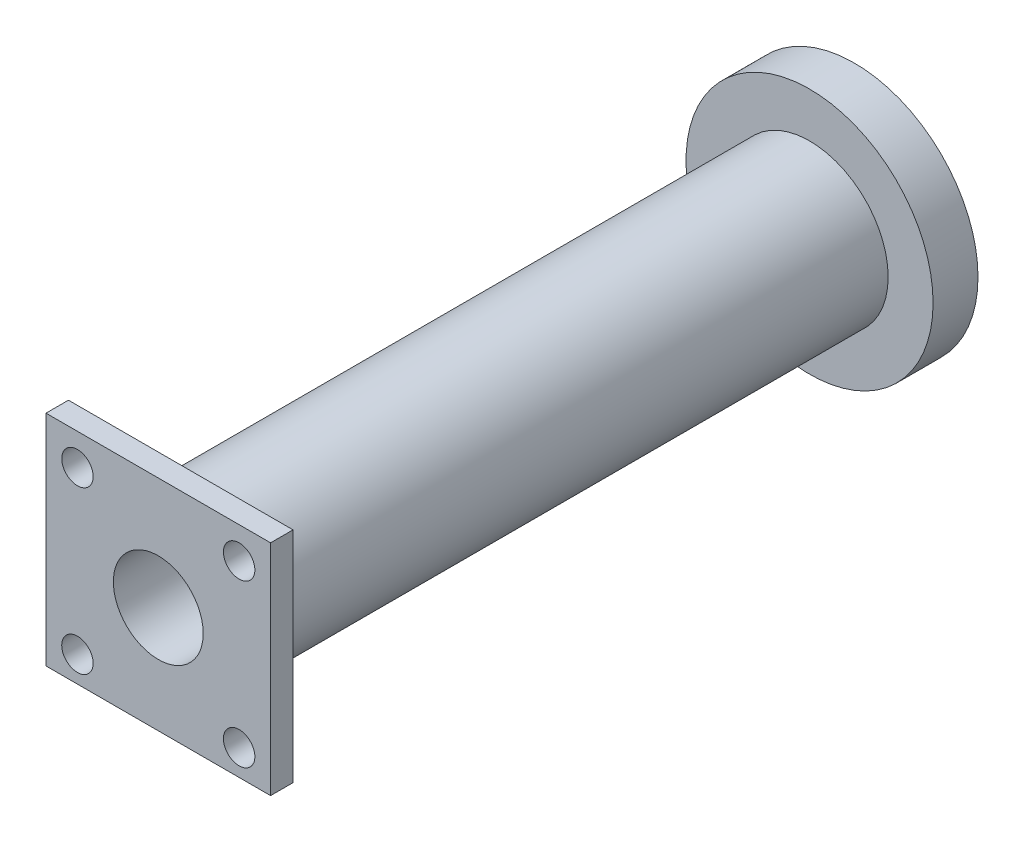
ISO-10303-21;
HEADER;
FILE_DESCRIPTION(('STEP AP214'),'2;1');
FILE_NAME('part.step','',(''),(''),'','','');
FILE_SCHEMA(('AUTOMOTIVE_DESIGN { 1 0 10303 214 1 1 1 1 }'));
ENDSEC;
DATA;
#1=APPLICATION_CONTEXT('core data for automotive mechanical design processes');
#2=APPLICATION_PROTOCOL_DEFINITION('international standard','automotive_design',2000,#1);
#3=PRODUCT_CONTEXT('',#1,'mechanical');
#4=PRODUCT('Part','Part','',(#3));
#5=PRODUCT_RELATED_PRODUCT_CATEGORY('part','',(#4));
#6=PRODUCT_DEFINITION_FORMATION('','',#4);
#7=PRODUCT_DEFINITION_CONTEXT('part definition',#1,'design');
#8=PRODUCT_DEFINITION('design','',#6,#7);
#9=PRODUCT_DEFINITION_SHAPE('','',#8);
#10=(LENGTH_UNIT() NAMED_UNIT(*) SI_UNIT(.MILLI.,.METRE.));
#11=(NAMED_UNIT(*) PLANE_ANGLE_UNIT() SI_UNIT($,.RADIAN.));
#12=(NAMED_UNIT(*) SI_UNIT($,.STERADIAN.) SOLID_ANGLE_UNIT());
#13=UNCERTAINTY_MEASURE_WITH_UNIT(LENGTH_MEASURE(1.E-05),#10,'distance_accuracy_value','');
#14=(GEOMETRIC_REPRESENTATION_CONTEXT(3) GLOBAL_UNCERTAINTY_ASSIGNED_CONTEXT((#13)) GLOBAL_UNIT_ASSIGNED_CONTEXT((#10,
#11,#12)) REPRESENTATION_CONTEXT('',''));
#15=CARTESIAN_POINT('',(0.,0.,0.));
#16=DIRECTION('',(0.,0.,1.));
#17=DIRECTION('',(1.,0.,0.));
#18=AXIS2_PLACEMENT_3D('',#15,#16,#17);
#19=CARTESIAN_POINT('',(0.,0.,50.8));
#20=DIRECTION('',(0.,0.,-1.));
#21=DIRECTION('',(-1.,0.,0.));
#22=AXIS2_PLACEMENT_3D('',#19,#20,#21);
#23=CYLINDRICAL_SURFACE('',#22,139.7);
#24=CARTESIAN_POINT('',(0.,0.,50.8));
#25=DIRECTION('',(0.,0.,1.));
#26=DIRECTION('',(1.,0.,0.));
#27=AXIS2_PLACEMENT_3D('',#24,#25,#26);
#28=CIRCLE('',#27,139.7);
#29=CARTESIAN_POINT('',(139.7,0.,50.8));
#30=VERTEX_POINT('',#29);
#31=EDGE_CURVE('E11',#30,#30,#28,.T.);
#32=ORIENTED_EDGE('',*,*,#31,.F.);
#33=EDGE_LOOP('',(#32));
#34=FACE_BOUND('',#33,.T.);
#35=CARTESIAN_POINT('',(0.,0.,0.));
#36=DIRECTION('',(0.,0.,1.));
#37=DIRECTION('',(1.,0.,0.));
#38=AXIS2_PLACEMENT_3D('',#35,#36,#37);
#39=CIRCLE('',#38,139.7);
#40=CARTESIAN_POINT('',(139.7,0.,0.));
#41=VERTEX_POINT('',#40);
#42=EDGE_CURVE('E42',#41,#41,#39,.T.);
#43=ORIENTED_EDGE('',*,*,#42,.T.);
#44=EDGE_LOOP('',(#43));
#45=FACE_BOUND('',#44,.T.);
#46=ADVANCED_FACE('F39',(#34,#45),#23,.T.);
#47=CARTESIAN_POINT('',(0.,0.,50.8));
#48=DIRECTION('',(0.,0.,1.));
#49=DIRECTION('',(1.,0.,0.));
#50=AXIS2_PLACEMENT_3D('',#47,#48,#49);
#51=PLANE('',#50);
#52=CARTESIAN_POINT('',(0.,0.,50.8));
#53=DIRECTION('',(0.,0.,1.));
#54=DIRECTION('',(1.,0.,0.));
#55=AXIS2_PLACEMENT_3D('',#52,#53,#54);
#56=CIRCLE('',#55,88.9);
#57=CARTESIAN_POINT('',(88.9,0.,50.8));
#58=VERTEX_POINT('',#57);
#59=EDGE_CURVE('E48',#58,#58,#56,.T.);
#60=ORIENTED_EDGE('',*,*,#59,.F.);
#61=EDGE_LOOP('',(#60));
#62=FACE_BOUND('',#61,.T.);
#63=ORIENTED_EDGE('',*,*,#31,.T.);
#64=EDGE_LOOP('',(#63));
#65=FACE_BOUND('',#64,.T.);
#66=ADVANCED_FACE('F135',(#62,#65),#51,.T.);
#67=CARTESIAN_POINT('',(0.,0.,0.));
#68=DIRECTION('',(0.,0.,1.));
#69=DIRECTION('',(1.,0.,0.));
#70=AXIS2_PLACEMENT_3D('',#67,#68,#69);
#71=PLANE('',#70);
#72=ORIENTED_EDGE('',*,*,#42,.F.);
#73=EDGE_LOOP('',(#72));
#74=FACE_BOUND('',#73,.T.);
#75=CARTESIAN_POINT('',(0.,0.,0.));
#76=DIRECTION('',(0.,0.,1.));
#77=DIRECTION('',(1.,0.,0.));
#78=AXIS2_PLACEMENT_3D('',#75,#76,#77);
#79=CIRCLE('',#78,50.8);
#80=CARTESIAN_POINT('',(50.8,0.,0.));
#81=VERTEX_POINT('',#80);
#82=EDGE_CURVE('E118',#81,#81,#79,.T.);
#83=ORIENTED_EDGE('',*,*,#82,.T.);
#84=EDGE_LOOP('',(#83));
#85=FACE_BOUND('',#84,.T.);
#86=ADVANCED_FACE('F131',(#74,#85),#71,.F.);
#87=CARTESIAN_POINT('',(0.,0.,762.));
#88=DIRECTION('',(0.,0.,-1.));
#89=DIRECTION('',(-1.,0.,0.));
#90=AXIS2_PLACEMENT_3D('',#87,#88,#89);
#91=CYLINDRICAL_SURFACE('',#90,50.8);
#92=ORIENTED_EDGE('',*,*,#82,.F.);
#93=EDGE_LOOP('',(#92));
#94=FACE_BOUND('',#93,.T.);
#95=CARTESIAN_POINT('',(0.,0.,787.4));
#96=DIRECTION('',(0.,0.,1.));
#97=DIRECTION('',(1.,0.,0.));
#98=AXIS2_PLACEMENT_3D('',#95,#96,#97);
#99=CIRCLE('',#98,50.8);
#100=CARTESIAN_POINT('',(50.8,0.,787.4));
#101=VERTEX_POINT('',#100);
#102=EDGE_CURVE('E144',#101,#101,#99,.T.);
#103=ORIENTED_EDGE('',*,*,#102,.T.);
#104=EDGE_LOOP('',(#103));
#105=FACE_BOUND('',#104,.T.);
#106=ADVANCED_FACE('F134',(#94,#105),#91,.F.);
#107=CARTESIAN_POINT('',(0.,0.,762.));
#108=DIRECTION('',(0.,0.,-1.));
#109=DIRECTION('',(-1.,0.,0.));
#110=AXIS2_PLACEMENT_3D('',#107,#108,#109);
#111=CYLINDRICAL_SURFACE('',#110,88.9);
#112=ORIENTED_EDGE('',*,*,#59,.T.);
#113=EDGE_LOOP('',(#112));
#114=FACE_BOUND('',#113,.T.);
#115=CARTESIAN_POINT('',(0.,0.,762.));
#116=DIRECTION('',(0.,0.,1.));
#117=DIRECTION('',(1.,0.,0.));
#118=AXIS2_PLACEMENT_3D('',#115,#116,#117);
#119=CIRCLE('',#118,88.9);
#120=CARTESIAN_POINT('',(88.9,0.,762.));
#121=VERTEX_POINT('',#120);
#122=EDGE_CURVE('E119',#121,#121,#119,.T.);
#123=ORIENTED_EDGE('',*,*,#122,.F.);
#124=EDGE_LOOP('',(#123));
#125=FACE_BOUND('',#124,.T.);
#126=ADVANCED_FACE('F140',(#114,#125),#111,.T.);
#127=CARTESIAN_POINT('',(0.,0.,787.4));
#128=DIRECTION('',(0.,0.,1.));
#129=DIRECTION('',(1.,0.,0.));
#130=AXIS2_PLACEMENT_3D('',#127,#128,#129);
#131=PLANE('',#130);
#132=CARTESIAN_POINT('',(-91.44,-91.44,787.4));
#133=DIRECTION('',(0.,0.,1.));
#134=DIRECTION('',(-1.,0.,0.));
#135=AXIS2_PLACEMENT_3D('',#132,#133,#134);
#136=CIRCLE('',#135,17.78);
#137=CARTESIAN_POINT('',(-109.22,-91.44,787.4));
#138=VERTEX_POINT('',#137);
#139=EDGE_CURVE('E149',#138,#138,#136,.T.);
#140=ORIENTED_EDGE('',*,*,#139,.F.);
#141=EDGE_LOOP('',(#140));
#142=FACE_BOUND('',#141,.T.);
#143=CARTESIAN_POINT('',(91.44,91.44,787.4));
#144=DIRECTION('',(0.,0.,1.));
#145=DIRECTION('',(-1.,0.,0.));
#146=AXIS2_PLACEMENT_3D('',#143,#144,#145);
#147=CIRCLE('',#146,17.78);
#148=CARTESIAN_POINT('',(73.6600000000001,91.44,787.4));
#149=VERTEX_POINT('',#148);
#150=EDGE_CURVE('E161',#149,#149,#147,.T.);
#151=ORIENTED_EDGE('',*,*,#150,.F.);
#152=EDGE_LOOP('',(#151));
#153=FACE_BOUND('',#152,.T.);
#154=DIRECTION('',(0.,-1.,0.));
#155=VECTOR('',#154,1.);
#156=CARTESIAN_POINT('',(-127.,127.,787.4));
#157=LINE('',#156,#155);
#158=CARTESIAN_POINT('',(-127.,127.,787.4));
#159=VERTEX_POINT('',#158);
#160=CARTESIAN_POINT('',(-127.,-120.65,787.4));
#161=VERTEX_POINT('',#160);
#162=EDGE_CURVE('E93',#159,#161,#157,.T.);
#163=ORIENTED_EDGE('',*,*,#162,.T.);
#164=DIRECTION('',(1.,0.,0.));
#165=VECTOR('',#164,1.);
#166=CARTESIAN_POINT('',(-127.,-120.65,787.4));
#167=LINE('',#166,#165);
#168=CARTESIAN_POINT('',(127.,-120.65,787.4));
#169=VERTEX_POINT('',#168);
#170=EDGE_CURVE('E87',#161,#169,#167,.T.);
#171=ORIENTED_EDGE('',*,*,#170,.T.);
#172=DIRECTION('',(0.,1.,0.));
#173=VECTOR('',#172,1.);
#174=CARTESIAN_POINT('',(127.,127.,787.4));
#175=LINE('',#174,#173);
#176=CARTESIAN_POINT('',(127.,127.,787.4));
#177=VERTEX_POINT('',#176);
#178=EDGE_CURVE('E91',#169,#177,#175,.T.);
#179=ORIENTED_EDGE('',*,*,#178,.T.);
#180=DIRECTION('',(-1.,0.,0.));
#181=VECTOR('',#180,1.);
#182=CARTESIAN_POINT('',(-127.,127.,787.4));
#183=LINE('',#182,#181);
#184=EDGE_CURVE('E56',#177,#159,#183,.T.);
#185=ORIENTED_EDGE('',*,*,#184,.T.);
#186=EDGE_LOOP('',(#163,#171,#179,#185));
#187=FACE_BOUND('',#186,.T.);
#188=CARTESIAN_POINT('',(-91.44,91.44,787.4));
#189=DIRECTION('',(0.,0.,1.));
#190=DIRECTION('',(1.,0.,0.));
#191=AXIS2_PLACEMENT_3D('',#188,#189,#190);
#192=CIRCLE('',#191,17.78);
#193=CARTESIAN_POINT('',(-73.6600000000001,91.44,787.4));
#194=VERTEX_POINT('',#193);
#195=EDGE_CURVE('E111',#194,#194,#192,.T.);
#196=ORIENTED_EDGE('',*,*,#195,.F.);
#197=EDGE_LOOP('',(#196));
#198=FACE_BOUND('',#197,.T.);
#199=CARTESIAN_POINT('',(91.44,-91.44,787.4));
#200=DIRECTION('',(0.,0.,1.));
#201=DIRECTION('',(1.,0.,0.));
#202=AXIS2_PLACEMENT_3D('',#199,#200,#201);
#203=CIRCLE('',#202,17.78);
#204=CARTESIAN_POINT('',(109.22,-91.44,787.4));
#205=VERTEX_POINT('',#204);
#206=EDGE_CURVE('E155',#205,#205,#203,.T.);
#207=ORIENTED_EDGE('',*,*,#206,.F.);
#208=EDGE_LOOP('',(#207));
#209=FACE_BOUND('',#208,.T.);
#210=ORIENTED_EDGE('',*,*,#102,.F.);
#211=EDGE_LOOP('',(#210));
#212=FACE_BOUND('',#211,.T.);
#213=ADVANCED_FACE('F88',(#142,#153,#187,#198,#209,#212),#131,.T.);
#214=CARTESIAN_POINT('',(0.,0.,762.));
#215=DIRECTION('',(0.,0.,1.));
#216=DIRECTION('',(1.,0.,0.));
#217=AXIS2_PLACEMENT_3D('',#214,#215,#216);
#218=PLANE('',#217);
#219=ORIENTED_EDGE('',*,*,#122,.T.);
#220=EDGE_LOOP('',(#219));
#221=FACE_BOUND('',#220,.T.);
#222=DIRECTION('',(0.,-1.,0.));
#223=VECTOR('',#222,1.);
#224=CARTESIAN_POINT('',(-127.,127.,762.));
#225=LINE('',#224,#223);
#226=CARTESIAN_POINT('',(-127.,127.,762.));
#227=VERTEX_POINT('',#226);
#228=CARTESIAN_POINT('',(-127.,-120.65,762.));
#229=VERTEX_POINT('',#228);
#230=EDGE_CURVE('E108',#227,#229,#225,.T.);
#231=ORIENTED_EDGE('',*,*,#230,.F.);
#232=DIRECTION('',(-1.,0.,0.));
#233=VECTOR('',#232,1.);
#234=CARTESIAN_POINT('',(-127.,127.,762.));
#235=LINE('',#234,#233);
#236=CARTESIAN_POINT('',(127.,127.,762.));
#237=VERTEX_POINT('',#236);
#238=EDGE_CURVE('E79',#237,#227,#235,.T.);
#239=ORIENTED_EDGE('',*,*,#238,.F.);
#240=DIRECTION('',(0.,1.,0.));
#241=VECTOR('',#240,1.);
#242=CARTESIAN_POINT('',(127.,127.,762.));
#243=LINE('',#242,#241);
#244=CARTESIAN_POINT('',(127.,-120.65,762.));
#245=VERTEX_POINT('',#244);
#246=EDGE_CURVE('E73',#245,#237,#243,.T.);
#247=ORIENTED_EDGE('',*,*,#246,.F.);
#248=DIRECTION('',(1.,0.,0.));
#249=VECTOR('',#248,1.);
#250=CARTESIAN_POINT('',(-127.,-120.65,762.));
#251=LINE('',#250,#249);
#252=EDGE_CURVE('E98',#229,#245,#251,.T.);
#253=ORIENTED_EDGE('',*,*,#252,.F.);
#254=EDGE_LOOP('',(#231,#239,#247,#253));
#255=FACE_BOUND('',#254,.T.);
#256=CARTESIAN_POINT('',(-91.44,91.44,762.));
#257=DIRECTION('',(0.,0.,1.));
#258=DIRECTION('',(1.,0.,0.));
#259=AXIS2_PLACEMENT_3D('',#256,#257,#258);
#260=CIRCLE('',#259,17.78);
#261=CARTESIAN_POINT('',(-73.6600000000001,91.44,762.));
#262=VERTEX_POINT('',#261);
#263=EDGE_CURVE('E164',#262,#262,#260,.T.);
#264=ORIENTED_EDGE('',*,*,#263,.T.);
#265=EDGE_LOOP('',(#264));
#266=FACE_BOUND('',#265,.T.);
#267=CARTESIAN_POINT('',(91.44,91.44,762.));
#268=DIRECTION('',(0.,0.,1.));
#269=DIRECTION('',(-1.,0.,0.));
#270=AXIS2_PLACEMENT_3D('',#267,#268,#269);
#271=CIRCLE('',#270,17.78);
#272=CARTESIAN_POINT('',(73.6600000000001,91.44,762.));
#273=VERTEX_POINT('',#272);
#274=EDGE_CURVE('E158',#273,#273,#271,.T.);
#275=ORIENTED_EDGE('',*,*,#274,.T.);
#276=EDGE_LOOP('',(#275));
#277=FACE_BOUND('',#276,.T.);
#278=CARTESIAN_POINT('',(91.44,-91.44,762.));
#279=DIRECTION('',(0.,0.,1.));
#280=DIRECTION('',(1.,0.,0.));
#281=AXIS2_PLACEMENT_3D('',#278,#279,#280);
#282=CIRCLE('',#281,17.78);
#283=CARTESIAN_POINT('',(109.22,-91.44,762.));
#284=VERTEX_POINT('',#283);
#285=EDGE_CURVE('E153',#284,#284,#282,.T.);
#286=ORIENTED_EDGE('',*,*,#285,.T.);
#287=EDGE_LOOP('',(#286));
#288=FACE_BOUND('',#287,.T.);
#289=CARTESIAN_POINT('',(-91.44,-91.44,762.));
#290=DIRECTION('',(0.,0.,1.));
#291=DIRECTION('',(-1.,0.,0.));
#292=AXIS2_PLACEMENT_3D('',#289,#290,#291);
#293=CIRCLE('',#292,17.78);
#294=CARTESIAN_POINT('',(-109.22,-91.44,762.));
#295=VERTEX_POINT('',#294);
#296=EDGE_CURVE('E146',#295,#295,#293,.T.);
#297=ORIENTED_EDGE('',*,*,#296,.T.);
#298=EDGE_LOOP('',(#297));
#299=FACE_BOUND('',#298,.T.);
#300=ADVANCED_FACE('F172',(#221,#255,#266,#277,#288,#299),#218,.F.);
#301=CARTESIAN_POINT('',(-127.,127.,787.4));
#302=DIRECTION('',(1.,0.,0.));
#303=DIRECTION('',(0.,1.,0.));
#304=AXIS2_PLACEMENT_3D('',#301,#302,#303);
#305=PLANE('',#304);
#306=ORIENTED_EDGE('',*,*,#230,.T.);
#307=DIRECTION('',(0.,0.,-1.));
#308=VECTOR('',#307,1.);
#309=CARTESIAN_POINT('',(-127.,-120.65,787.4));
#310=LINE('',#309,#308);
#311=EDGE_CURVE('E99',#161,#229,#310,.T.);
#312=ORIENTED_EDGE('',*,*,#311,.F.);
#313=ORIENTED_EDGE('',*,*,#162,.F.);
#314=DIRECTION('',(0.,0.,-1.));
#315=VECTOR('',#314,1.);
#316=CARTESIAN_POINT('',(-127.,127.,787.4));
#317=LINE('',#316,#315);
#318=EDGE_CURVE('E104',#159,#227,#317,.T.);
#319=ORIENTED_EDGE('',*,*,#318,.T.);
#320=EDGE_LOOP('',(#306,#312,#313,#319));
#321=FACE_BOUND('',#320,.T.);
#322=ADVANCED_FACE('F204',(#321),#305,.F.);
#323=CARTESIAN_POINT('',(-127.,-120.65,787.4));
#324=DIRECTION('',(0.,1.,0.));
#325=DIRECTION('',(0.,0.,1.));
#326=AXIS2_PLACEMENT_3D('',#323,#324,#325);
#327=PLANE('',#326);
#328=ORIENTED_EDGE('',*,*,#252,.T.);
#329=DIRECTION('',(0.,0.,-1.));
#330=VECTOR('',#329,1.);
#331=CARTESIAN_POINT('',(127.,-120.65,787.4));
#332=LINE('',#331,#330);
#333=EDGE_CURVE('E96',#169,#245,#332,.T.);
#334=ORIENTED_EDGE('',*,*,#333,.F.);
#335=ORIENTED_EDGE('',*,*,#170,.F.);
#336=ORIENTED_EDGE('',*,*,#311,.T.);
#337=EDGE_LOOP('',(#328,#334,#335,#336));
#338=FACE_BOUND('',#337,.T.);
#339=ADVANCED_FACE('F97',(#338),#327,.F.);
#340=CARTESIAN_POINT('',(127.,127.,787.4));
#341=DIRECTION('',(-1.,0.,0.));
#342=DIRECTION('',(0.,-1.,0.));
#343=AXIS2_PLACEMENT_3D('',#340,#341,#342);
#344=PLANE('',#343);
#345=ORIENTED_EDGE('',*,*,#246,.T.);
#346=DIRECTION('',(0.,0.,-1.));
#347=VECTOR('',#346,1.);
#348=CARTESIAN_POINT('',(127.,127.,787.4));
#349=LINE('',#348,#347);
#350=EDGE_CURVE('E100',#177,#237,#349,.T.);
#351=ORIENTED_EDGE('',*,*,#350,.F.);
#352=ORIENTED_EDGE('',*,*,#178,.F.);
#353=ORIENTED_EDGE('',*,*,#333,.T.);
#354=EDGE_LOOP('',(#345,#351,#352,#353));
#355=FACE_BOUND('',#354,.T.);
#356=ADVANCED_FACE('F102',(#355),#344,.F.);
#357=CARTESIAN_POINT('',(-127.,127.,787.4));
#358=DIRECTION('',(0.,-1.,0.));
#359=DIRECTION('',(0.,0.,-1.));
#360=AXIS2_PLACEMENT_3D('',#357,#358,#359);
#361=PLANE('',#360);
#362=ORIENTED_EDGE('',*,*,#238,.T.);
#363=ORIENTED_EDGE('',*,*,#318,.F.);
#364=ORIENTED_EDGE('',*,*,#184,.F.);
#365=ORIENTED_EDGE('',*,*,#350,.T.);
#366=EDGE_LOOP('',(#362,#363,#364,#365));
#367=FACE_BOUND('',#366,.T.);
#368=ADVANCED_FACE('F178',(#367),#361,.F.);
#369=CARTESIAN_POINT('',(-91.44,91.44,787.4));
#370=DIRECTION('',(0.,0.,-1.));
#371=DIRECTION('',(-1.,0.,0.));
#372=AXIS2_PLACEMENT_3D('',#369,#370,#371);
#373=CYLINDRICAL_SURFACE('',#372,17.78);
#374=ORIENTED_EDGE('',*,*,#195,.T.);
#375=EDGE_LOOP('',(#374));
#376=FACE_BOUND('',#375,.T.);
#377=ORIENTED_EDGE('',*,*,#263,.F.);
#378=EDGE_LOOP('',(#377));
#379=FACE_BOUND('',#378,.T.);
#380=ADVANCED_FACE('F175',(#376,#379),#373,.F.);
#381=CARTESIAN_POINT('',(91.44,91.44,787.4));
#382=DIRECTION('',(0.,0.,-1.));
#383=DIRECTION('',(-1.,0.,0.));
#384=AXIS2_PLACEMENT_3D('',#381,#382,#383);
#385=CYLINDRICAL_SURFACE('',#384,17.78);
#386=ORIENTED_EDGE('',*,*,#150,.T.);
#387=EDGE_LOOP('',(#386));
#388=FACE_BOUND('',#387,.T.);
#389=ORIENTED_EDGE('',*,*,#274,.F.);
#390=EDGE_LOOP('',(#389));
#391=FACE_BOUND('',#390,.T.);
#392=ADVANCED_FACE('F177',(#388,#391),#385,.F.);
#393=CARTESIAN_POINT('',(91.44,-91.44,787.4));
#394=DIRECTION('',(0.,0.,-1.));
#395=DIRECTION('',(-1.,0.,0.));
#396=AXIS2_PLACEMENT_3D('',#393,#394,#395);
#397=CYLINDRICAL_SURFACE('',#396,17.78);
#398=ORIENTED_EDGE('',*,*,#206,.T.);
#399=EDGE_LOOP('',(#398));
#400=FACE_BOUND('',#399,.T.);
#401=ORIENTED_EDGE('',*,*,#285,.F.);
#402=EDGE_LOOP('',(#401));
#403=FACE_BOUND('',#402,.T.);
#404=ADVANCED_FACE('F185',(#400,#403),#397,.F.);
#405=CARTESIAN_POINT('',(-91.44,-91.44,787.4));
#406=DIRECTION('',(0.,0.,-1.));
#407=DIRECTION('',(-1.,0.,0.));
#408=AXIS2_PLACEMENT_3D('',#405,#406,#407);
#409=CYLINDRICAL_SURFACE('',#408,17.78);
#410=ORIENTED_EDGE('',*,*,#139,.T.);
#411=EDGE_LOOP('',(#410));
#412=FACE_BOUND('',#411,.T.);
#413=ORIENTED_EDGE('',*,*,#296,.F.);
#414=EDGE_LOOP('',(#413));
#415=FACE_BOUND('',#414,.T.);
#416=ADVANCED_FACE('F228',(#412,#415),#409,.F.);
#417=CLOSED_SHELL('',(#46,#66,#86,#106,#126,#213,#300,#322,#339,#356,#368,#380,#392,#404,#416));
#418=MANIFOLD_SOLID_BREP('B2',#417);
#419=ADVANCED_BREP_SHAPE_REPRESENTATION('',(#18,#418),#14);
#420=SHAPE_DEFINITION_REPRESENTATION(#9,#419);
ENDSEC;
END-ISO-10303-21;
